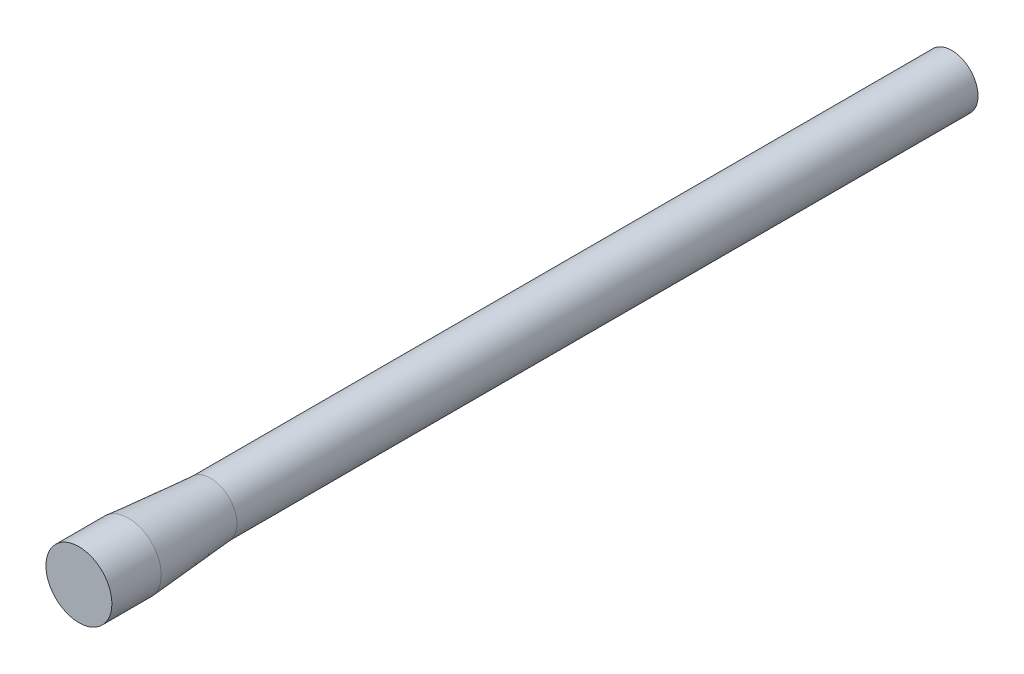
ISO-10303-21;
HEADER;
FILE_DESCRIPTION(('STEP AP214'),'2;1');
FILE_NAME('part.step','',(''),(''),'','','');
FILE_SCHEMA(('AUTOMOTIVE_DESIGN { 1 0 10303 214 1 1 1 1 }'));
ENDSEC;
DATA;
#1=APPLICATION_CONTEXT('core data for automotive mechanical design processes');
#2=APPLICATION_PROTOCOL_DEFINITION('international standard','automotive_design',2000,#1);
#3=PRODUCT_CONTEXT('',#1,'mechanical');
#4=PRODUCT('Part','Part','',(#3));
#5=PRODUCT_RELATED_PRODUCT_CATEGORY('part','',(#4));
#6=PRODUCT_DEFINITION_FORMATION('','',#4);
#7=PRODUCT_DEFINITION_CONTEXT('part definition',#1,'design');
#8=PRODUCT_DEFINITION('design','',#6,#7);
#9=PRODUCT_DEFINITION_SHAPE('','',#8);
#10=(LENGTH_UNIT() NAMED_UNIT(*) SI_UNIT(.MILLI.,.METRE.));
#11=(NAMED_UNIT(*) PLANE_ANGLE_UNIT() SI_UNIT($,.RADIAN.));
#12=(NAMED_UNIT(*) SI_UNIT($,.STERADIAN.) SOLID_ANGLE_UNIT());
#13=UNCERTAINTY_MEASURE_WITH_UNIT(LENGTH_MEASURE(1.E-05),#10,'distance_accuracy_value','');
#14=(GEOMETRIC_REPRESENTATION_CONTEXT(3) GLOBAL_UNCERTAINTY_ASSIGNED_CONTEXT((#13)) GLOBAL_UNIT_ASSIGNED_CONTEXT((#10,
#11,#12)) REPRESENTATION_CONTEXT('',''));
#15=CARTESIAN_POINT('',(0.,0.,0.));
#16=DIRECTION('',(0.,0.,1.));
#17=DIRECTION('',(1.,0.,0.));
#18=AXIS2_PLACEMENT_3D('',#15,#16,#17);
#19=CARTESIAN_POINT('',(0.,0.,45.));
#20=DIRECTION('',(0.,0.,-1.));
#21=DIRECTION('',(-1.,0.,0.));
#22=AXIS2_PLACEMENT_3D('',#19,#20,#21);
#23=CYLINDRICAL_SURFACE('',#22,1.6);
#24=CARTESIAN_POINT('',(0.,0.,45.));
#25=DIRECTION('',(0.,0.,1.));
#26=DIRECTION('',(1.,0.,0.));
#27=AXIS2_PLACEMENT_3D('',#24,#25,#26);
#28=CIRCLE('',#27,1.6);
#29=CARTESIAN_POINT('',(-1.6,0.,45.));
#30=VERTEX_POINT('',#29);
#31=EDGE_CURVE('E10',#30,#30,#28,.T.);
#32=CARTESIAN_POINT('',(0.,0.,0.));
#33=DIRECTION('',(0.,0.,1.));
#34=DIRECTION('',(1.,0.,0.));
#35=AXIS2_PLACEMENT_3D('',#32,#33,#34);
#36=CIRCLE('',#35,1.6);
#37=CARTESIAN_POINT('',(-1.6,0.,0.));
#38=VERTEX_POINT('',#37);
#39=EDGE_CURVE('E40',#38,#38,#36,.T.);
#40=CARTESIAN_POINT('',(-1.6,0.,45.));
#41=CARTESIAN_POINT('',(-1.6,0.,44.53125));
#42=CARTESIAN_POINT('',(-1.6,0.,44.0625));
#43=CARTESIAN_POINT('',(-1.6,0.,43.125));
#44=CARTESIAN_POINT('',(-1.6,0.,42.65625));
#45=CARTESIAN_POINT('',(-1.6,0.,41.71875));
#46=CARTESIAN_POINT('',(-1.6,0.,41.25));
#47=CARTESIAN_POINT('',(-1.6,0.,40.3125));
#48=CARTESIAN_POINT('',(-1.6,0.,39.84375));
#49=CARTESIAN_POINT('',(-1.6,0.,38.90625));
#50=CARTESIAN_POINT('',(-1.6,0.,38.4375));
#51=CARTESIAN_POINT('',(-1.6,0.,37.5));
#52=CARTESIAN_POINT('',(-1.6,0.,37.03125));
#53=CARTESIAN_POINT('',(-1.6,0.,36.09375));
#54=CARTESIAN_POINT('',(-1.6,0.,35.625));
#55=CARTESIAN_POINT('',(-1.6,0.,34.6875));
#56=CARTESIAN_POINT('',(-1.6,0.,34.21875));
#57=CARTESIAN_POINT('',(-1.6,0.,33.28125));
#58=CARTESIAN_POINT('',(-1.6,0.,32.8125));
#59=CARTESIAN_POINT('',(-1.6,0.,31.875));
#60=CARTESIAN_POINT('',(-1.6,0.,31.40625));
#61=CARTESIAN_POINT('',(-1.6,0.,30.46875));
#62=CARTESIAN_POINT('',(-1.6,0.,30.));
#63=CARTESIAN_POINT('',(-1.6,0.,29.0625));
#64=CARTESIAN_POINT('',(-1.6,0.,28.59375));
#65=CARTESIAN_POINT('',(-1.6,0.,27.65625));
#66=CARTESIAN_POINT('',(-1.6,0.,27.1875));
#67=CARTESIAN_POINT('',(-1.6,0.,26.25));
#68=CARTESIAN_POINT('',(-1.6,0.,25.78125));
#69=CARTESIAN_POINT('',(-1.6,0.,24.84375));
#70=CARTESIAN_POINT('',(-1.6,0.,24.375));
#71=CARTESIAN_POINT('',(-1.6,0.,23.4375));
#72=CARTESIAN_POINT('',(-1.6,0.,22.96875));
#73=CARTESIAN_POINT('',(-1.6,0.,22.03125));
#74=CARTESIAN_POINT('',(-1.6,0.,21.5625));
#75=CARTESIAN_POINT('',(-1.6,0.,20.625));
#76=CARTESIAN_POINT('',(-1.6,0.,20.15625));
#77=CARTESIAN_POINT('',(-1.6,0.,19.21875));
#78=CARTESIAN_POINT('',(-1.6,0.,18.75));
#79=CARTESIAN_POINT('',(-1.6,0.,17.8125));
#80=CARTESIAN_POINT('',(-1.6,0.,17.34375));
#81=CARTESIAN_POINT('',(-1.6,0.,16.40625));
#82=CARTESIAN_POINT('',(-1.6,0.,15.9375));
#83=CARTESIAN_POINT('',(-1.6,0.,15.));
#84=CARTESIAN_POINT('',(-1.6,0.,14.53125));
#85=CARTESIAN_POINT('',(-1.6,0.,13.59375));
#86=CARTESIAN_POINT('',(-1.6,0.,13.125));
#87=CARTESIAN_POINT('',(-1.6,0.,12.1875));
#88=CARTESIAN_POINT('',(-1.6,0.,11.71875));
#89=CARTESIAN_POINT('',(-1.6,0.,10.78125));
#90=CARTESIAN_POINT('',(-1.6,0.,10.3125));
#91=CARTESIAN_POINT('',(-1.6,0.,9.375));
#92=CARTESIAN_POINT('',(-1.6,0.,8.90625));
#93=CARTESIAN_POINT('',(-1.6,0.,7.96874999999999));
#94=CARTESIAN_POINT('',(-1.6,0.,7.5));
#95=CARTESIAN_POINT('',(-1.6,0.,6.5625));
#96=CARTESIAN_POINT('',(-1.6,0.,6.09375));
#97=CARTESIAN_POINT('',(-1.6,0.,5.15625));
#98=CARTESIAN_POINT('',(-1.6,0.,4.68749999999999));
#99=CARTESIAN_POINT('',(-1.6,0.,3.74999999999999));
#100=CARTESIAN_POINT('',(-1.6,0.,3.28124999999999));
#101=CARTESIAN_POINT('',(-1.6,0.,2.34374999999999));
#102=CARTESIAN_POINT('',(-1.6,0.,1.87499999999999));
#103=CARTESIAN_POINT('',(-1.6,0.,0.937499999999992));
#104=CARTESIAN_POINT('',(-1.6,0.,0.468749999999993));
#105=CARTESIAN_POINT('',(-1.6,0.,0.));
#106=B_SPLINE_CURVE_WITH_KNOTS('',3,(#40,#41,#42,#43,#44,#45,#46,#47,#48,#49,#50,#51,#52,#53,
#54,#55,#56,#57,#58,#59,#60,#61,#62,#63,#64,#65,#66,#67,#68,#69,#70,#71,#72,#73,#74,#75,#76,#77,
#78,#79,#80,#81,#82,#83,#84,#85,#86,#87,#88,#89,#90,#91,#92,#93,#94,#95,#96,#97,#98,#99,#100,
#101,#102,#103,#104,#105),.UNSPECIFIED.,.F.,.F.,(4,2,2,2,2,2,2,2,2,2,2,2,2,2,2,2,2,2,2,2,2,2,2,
2,2,2,2,2,2,2,2,2,4),(0.,1.40625,2.8125,4.21875000000001,5.62500000000001,7.03125,8.4375,
9.84375000000001,11.25,12.65625,14.0625,15.46875,16.875,18.28125,19.6875,21.09375,22.5,23.90625,
25.3125,26.71875,28.125,29.53125,30.9375,32.34375,33.75,35.15625,36.5625,37.96875,39.375,
40.78125,42.1875,43.59375,45.),.UNSPECIFIED.);
#107=EDGE_CURVE('BSEAM37',#30,#38,#106,.T.);
#108=ORIENTED_EDGE('',*,*,#31,.F.);
#109=ORIENTED_EDGE('',*,*,#39,.T.);
#110=ORIENTED_EDGE('',*,*,#107,.T.);
#111=ORIENTED_EDGE('',*,*,#107,.F.);
#112=EDGE_LOOP('',(#108,#110,#109,#111));
#113=FACE_BOUND('',#112,.T.);
#114=ADVANCED_FACE('F37',(#113),#23,.T.);
#115=CARTESIAN_POINT('',(0.,0.,0.));
#116=DIRECTION('',(0.,0.,1.));
#117=DIRECTION('',(1.,0.,0.));
#118=AXIS2_PLACEMENT_3D('',#115,#116,#117);
#119=PLANE('',#118);
#120=ORIENTED_EDGE('',*,*,#39,.F.);
#121=EDGE_LOOP('',(#120));
#122=FACE_BOUND('',#121,.T.);
#123=ADVANCED_FACE('F65',(#122),#119,.F.);
#124=CARTESIAN_POINT('',(0.,0.,45.));
#125=DIRECTION('',(0.,0.,1.));
#126=DIRECTION('',(1.,0.,0.));
#127=AXIS2_PLACEMENT_3D('',#124,#125,#126);
#128=CONICAL_SURFACE('',#127,1.6,0.0802851455917393);
#129=CARTESIAN_POINT('',(0.,0.,50.));
#130=DIRECTION('',(0.,0.,1.));
#131=DIRECTION('',(1.,0.,0.));
#132=AXIS2_PLACEMENT_3D('',#129,#130,#131);
#133=CIRCLE('',#132,2.00229044807343);
#134=CARTESIAN_POINT('',(2.00229044807343,0.,50.));
#135=VERTEX_POINT('',#134);
#136=EDGE_CURVE('E47',#135,#135,#133,.T.);
#137=ORIENTED_EDGE('',*,*,#136,.F.);
#138=EDGE_LOOP('',(#137));
#139=FACE_BOUND('',#138,.T.);
#140=ORIENTED_EDGE('',*,*,#31,.T.);
#141=EDGE_LOOP('',(#140));
#142=FACE_BOUND('',#141,.T.);
#143=ADVANCED_FACE('F60',(#139,#142),#128,.T.);
#144=CARTESIAN_POINT('',(0.,0.,53.));
#145=DIRECTION('',(0.,0.,-1.));
#146=DIRECTION('',(-1.,0.,0.));
#147=AXIS2_PLACEMENT_3D('',#144,#145,#146);
#148=CYLINDRICAL_SURFACE('',#147,2.00229044807343);
#149=CARTESIAN_POINT('',(0.,0.,53.));
#150=DIRECTION('',(0.,0.,1.));
#151=DIRECTION('',(1.,0.,0.));
#152=AXIS2_PLACEMENT_3D('',#149,#150,#151);
#153=CIRCLE('',#152,2.00229044807343);
#154=CARTESIAN_POINT('',(2.00229044807343,0.,53.));
#155=VERTEX_POINT('',#154);
#156=EDGE_CURVE('E51',#155,#155,#153,.T.);
#157=ORIENTED_EDGE('',*,*,#156,.F.);
#158=EDGE_LOOP('',(#157));
#159=FACE_BOUND('',#158,.T.);
#160=ORIENTED_EDGE('',*,*,#136,.T.);
#161=EDGE_LOOP('',(#160));
#162=FACE_BOUND('',#161,.T.);
#163=ADVANCED_FACE('F57',(#159,#162),#148,.T.);
#164=CARTESIAN_POINT('',(0.,0.,53.));
#165=DIRECTION('',(0.,0.,1.));
#166=DIRECTION('',(1.,0.,0.));
#167=AXIS2_PLACEMENT_3D('',#164,#165,#166);
#168=PLANE('',#167);
#169=ORIENTED_EDGE('',*,*,#156,.T.);
#170=EDGE_LOOP('',(#169));
#171=FACE_BOUND('',#170,.T.);
#172=ADVANCED_FACE('F55',(#171),#168,.T.);
#173=CLOSED_SHELL('',(#114,#123,#143,#163,#172));
#174=MANIFOLD_SOLID_BREP('B2',#173);
#175=ADVANCED_BREP_SHAPE_REPRESENTATION('',(#18,#174),#14);
#176=SHAPE_DEFINITION_REPRESENTATION(#9,#175);
ENDSEC;
END-ISO-10303-21;
